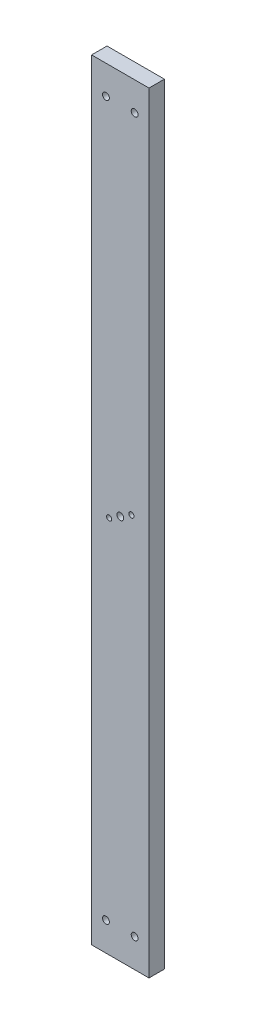
ISO-10303-21;
HEADER;
FILE_DESCRIPTION(('STEP AP214'),'2;1');
FILE_NAME('part.step','',(''),(''),'','','');
FILE_SCHEMA(('AUTOMOTIVE_DESIGN { 1 0 10303 214 1 1 1 1 }'));
ENDSEC;
DATA;
#1=APPLICATION_CONTEXT('core data for automotive mechanical design processes');
#2=APPLICATION_PROTOCOL_DEFINITION('international standard','automotive_design',2000,#1);
#3=PRODUCT_CONTEXT('',#1,'mechanical');
#4=PRODUCT('Part','Part','',(#3));
#5=PRODUCT_RELATED_PRODUCT_CATEGORY('part','',(#4));
#6=PRODUCT_DEFINITION_FORMATION('','',#4);
#7=PRODUCT_DEFINITION_CONTEXT('part definition',#1,'design');
#8=PRODUCT_DEFINITION('design','',#6,#7);
#9=PRODUCT_DEFINITION_SHAPE('','',#8);
#10=(LENGTH_UNIT() NAMED_UNIT(*) SI_UNIT(.MILLI.,.METRE.));
#11=(NAMED_UNIT(*) PLANE_ANGLE_UNIT() SI_UNIT($,.RADIAN.));
#12=(NAMED_UNIT(*) SI_UNIT($,.STERADIAN.) SOLID_ANGLE_UNIT());
#13=UNCERTAINTY_MEASURE_WITH_UNIT(LENGTH_MEASURE(1.E-05),#10,'distance_accuracy_value','');
#14=(GEOMETRIC_REPRESENTATION_CONTEXT(3) GLOBAL_UNCERTAINTY_ASSIGNED_CONTEXT((#13)) GLOBAL_UNIT_ASSIGNED_CONTEXT((#10,
#11,#12)) REPRESENTATION_CONTEXT('',''));
#15=CARTESIAN_POINT('',(0.,0.,0.));
#16=DIRECTION('',(0.,0.,1.));
#17=DIRECTION('',(1.,0.,0.));
#18=AXIS2_PLACEMENT_3D('',#15,#16,#17);
#19=CARTESIAN_POINT('',(0.,0.,18.));
#20=DIRECTION('',(0.,0.,1.));
#21=DIRECTION('',(1.,0.,0.));
#22=AXIS2_PLACEMENT_3D('',#19,#20,#21);
#23=PLANE('',#22);
#24=CARTESIAN_POINT('',(342.08843381725,405.447368421053,18.));
#25=DIRECTION('',(0.,0.,1.));
#26=DIRECTION('',(-1.,0.,0.));
#27=AXIS2_PLACEMENT_3D('',#24,#25,#26);
#28=CIRCLE('',#27,3.99999999999999);
#29=CARTESIAN_POINT('',(338.08843381725,405.447368421053,18.));
#30=VERTEX_POINT('',#29);
#31=EDGE_CURVE('E139',#30,#30,#28,.T.);
#32=ORIENTED_EDGE('',*,*,#31,.F.);
#33=EDGE_LOOP('',(#32));
#34=FACE_BOUND('',#33,.T.);
#35=CARTESIAN_POINT('',(308.58843381725,-427.552631578947,18.));
#36=DIRECTION('',(0.,0.,1.));
#37=DIRECTION('',(1.,0.,0.));
#38=AXIS2_PLACEMENT_3D('',#35,#36,#37);
#39=CIRCLE('',#38,3.99999999999999);
#40=CARTESIAN_POINT('',(312.58843381725,-427.552631578947,18.));
#41=VERTEX_POINT('',#40);
#42=EDGE_CURVE('E127',#41,#41,#39,.T.);
#43=ORIENTED_EDGE('',*,*,#42,.F.);
#44=EDGE_LOOP('',(#43));
#45=FACE_BOUND('',#44,.T.);
#46=CARTESIAN_POINT('',(312.33843381725,-19.0526315789474,18.));
#47=DIRECTION('',(0.,0.,1.));
#48=DIRECTION('',(1.,0.,0.));
#49=AXIS2_PLACEMENT_3D('',#46,#47,#48);
#50=CIRCLE('',#49,2.99999999999999);
#51=CARTESIAN_POINT('',(315.33843381725,-19.0526315789474,18.));
#52=VERTEX_POINT('',#51);
#53=EDGE_CURVE('E115',#52,#52,#50,.T.);
#54=ORIENTED_EDGE('',*,*,#53,.F.);
#55=EDGE_LOOP('',(#54));
#56=FACE_BOUND('',#55,.T.);
#57=DIRECTION('',(0.,-1.,0.));
#58=VECTOR('',#57,1.);
#59=CARTESIAN_POINT('',(291.83843381725,438.947368421053,18.));
#60=LINE('',#59,#58);
#61=CARTESIAN_POINT('',(291.83843381725,438.947368421053,18.));
#62=VERTEX_POINT('',#61);
#63=CARTESIAN_POINT('',(291.83843381725,-461.052631578947,18.));
#64=VERTEX_POINT('',#63);
#65=EDGE_CURVE('E85',#62,#64,#60,.T.);
#66=ORIENTED_EDGE('',*,*,#65,.T.);
#67=DIRECTION('',(1.,0.,0.));
#68=VECTOR('',#67,1.);
#69=CARTESIAN_POINT('',(291.83843381725,-461.052631578947,18.));
#70=LINE('',#69,#68);
#71=CARTESIAN_POINT('',(358.83843381725,-461.052631578947,18.));
#72=VERTEX_POINT('',#71);
#73=EDGE_CURVE('E80',#64,#72,#70,.T.);
#74=ORIENTED_EDGE('',*,*,#73,.T.);
#75=DIRECTION('',(0.,1.,0.));
#76=VECTOR('',#75,1.);
#77=CARTESIAN_POINT('',(358.83843381725,438.947368421053,18.));
#78=LINE('',#77,#76);
#79=CARTESIAN_POINT('',(358.83843381725,438.947368421053,18.));
#80=VERTEX_POINT('',#79);
#81=EDGE_CURVE('E83',#72,#80,#78,.T.);
#82=ORIENTED_EDGE('',*,*,#81,.T.);
#83=DIRECTION('',(-1.,0.,0.));
#84=VECTOR('',#83,1.);
#85=CARTESIAN_POINT('',(291.83843381725,438.947368421053,18.));
#86=LINE('',#85,#84);
#87=EDGE_CURVE('E50',#80,#62,#86,.T.);
#88=ORIENTED_EDGE('',*,*,#87,.T.);
#89=EDGE_LOOP('',(#66,#74,#82,#88));
#90=FACE_BOUND('',#89,.T.);
#91=CARTESIAN_POINT('',(325.33843381725,-11.0526315789474,18.));
#92=DIRECTION('',(0.,0.,1.));
#93=DIRECTION('',(1.,0.,0.));
#94=AXIS2_PLACEMENT_3D('',#91,#92,#93);
#95=CIRCLE('',#94,3.99999999999999);
#96=CARTESIAN_POINT('',(329.33843381725,-11.0526315789474,18.));
#97=VERTEX_POINT('',#96);
#98=EDGE_CURVE('E100',#97,#97,#95,.T.);
#99=ORIENTED_EDGE('',*,*,#98,.F.);
#100=EDGE_LOOP('',(#99));
#101=FACE_BOUND('',#100,.T.);
#102=CARTESIAN_POINT('',(338.33843381725,-3.05263157894737,18.));
#103=DIRECTION('',(0.,0.,1.));
#104=DIRECTION('',(1.,0.,0.));
#105=AXIS2_PLACEMENT_3D('',#102,#103,#104);
#106=CIRCLE('',#105,2.99999999999999);
#107=CARTESIAN_POINT('',(341.33843381725,-3.05263157894737,18.));
#108=VERTEX_POINT('',#107);
#109=EDGE_CURVE('E121',#108,#108,#106,.T.);
#110=ORIENTED_EDGE('',*,*,#109,.F.);
#111=EDGE_LOOP('',(#110));
#112=FACE_BOUND('',#111,.T.);
#113=CARTESIAN_POINT('',(342.08843381725,-427.552631578947,18.));
#114=DIRECTION('',(0.,0.,1.));
#115=DIRECTION('',(1.,0.,0.));
#116=AXIS2_PLACEMENT_3D('',#113,#114,#115);
#117=CIRCLE('',#116,3.99999999999999);
#118=CARTESIAN_POINT('',(346.08843381725,-427.552631578947,18.));
#119=VERTEX_POINT('',#118);
#120=EDGE_CURVE('E133',#119,#119,#117,.T.);
#121=ORIENTED_EDGE('',*,*,#120,.F.);
#122=EDGE_LOOP('',(#121));
#123=FACE_BOUND('',#122,.T.);
#124=CARTESIAN_POINT('',(308.58843381725,405.447368421053,18.));
#125=DIRECTION('',(0.,0.,1.));
#126=DIRECTION('',(-1.,0.,0.));
#127=AXIS2_PLACEMENT_3D('',#124,#125,#126);
#128=CIRCLE('',#127,3.99999999999999);
#129=CARTESIAN_POINT('',(304.58843381725,405.447368421053,18.));
#130=VERTEX_POINT('',#129);
#131=EDGE_CURVE('E145',#130,#130,#128,.T.);
#132=ORIENTED_EDGE('',*,*,#131,.F.);
#133=EDGE_LOOP('',(#132));
#134=FACE_BOUND('',#133,.T.);
#135=ADVANCED_FACE('F33',(#34,#45,#56,#90,#101,#112,#123,#134),#23,.T.);
#136=CARTESIAN_POINT('',(0.,0.,0.));
#137=DIRECTION('',(0.,0.,1.));
#138=DIRECTION('',(1.,0.,0.));
#139=AXIS2_PLACEMENT_3D('',#136,#137,#138);
#140=PLANE('',#139);
#141=DIRECTION('',(0.,-1.,0.));
#142=VECTOR('',#141,1.);
#143=CARTESIAN_POINT('',(291.83843381725,438.947368421053,0.));
#144=LINE('',#143,#142);
#145=CARTESIAN_POINT('',(291.83843381725,438.947368421053,0.));
#146=VERTEX_POINT('',#145);
#147=CARTESIAN_POINT('',(291.83843381725,-461.052631578947,0.));
#148=VERTEX_POINT('',#147);
#149=EDGE_CURVE('E97',#146,#148,#144,.T.);
#150=ORIENTED_EDGE('',*,*,#149,.F.);
#151=DIRECTION('',(-1.,0.,0.));
#152=VECTOR('',#151,1.);
#153=CARTESIAN_POINT('',(291.83843381725,438.947368421053,0.));
#154=LINE('',#153,#152);
#155=CARTESIAN_POINT('',(358.83843381725,438.947368421053,0.));
#156=VERTEX_POINT('',#155);
#157=EDGE_CURVE('E73',#156,#146,#154,.T.);
#158=ORIENTED_EDGE('',*,*,#157,.F.);
#159=DIRECTION('',(0.,1.,0.));
#160=VECTOR('',#159,1.);
#161=CARTESIAN_POINT('',(358.83843381725,438.947368421053,0.));
#162=LINE('',#161,#160);
#163=CARTESIAN_POINT('',(358.83843381725,-461.052631578947,0.));
#164=VERTEX_POINT('',#163);
#165=EDGE_CURVE('E67',#164,#156,#162,.T.);
#166=ORIENTED_EDGE('',*,*,#165,.F.);
#167=DIRECTION('',(1.,0.,0.));
#168=VECTOR('',#167,1.);
#169=CARTESIAN_POINT('',(291.83843381725,-461.052631578947,0.));
#170=LINE('',#169,#168);
#171=EDGE_CURVE('E89',#148,#164,#170,.T.);
#172=ORIENTED_EDGE('',*,*,#171,.F.);
#173=EDGE_LOOP('',(#150,#158,#166,#172));
#174=FACE_BOUND('',#173,.T.);
#175=CARTESIAN_POINT('',(325.33843381725,-11.0526315789474,0.));
#176=DIRECTION('',(0.,0.,1.));
#177=DIRECTION('',(1.,0.,0.));
#178=AXIS2_PLACEMENT_3D('',#175,#176,#177);
#179=CIRCLE('',#178,3.99999999999999);
#180=CARTESIAN_POINT('',(329.33843381725,-11.0526315789474,0.));
#181=VERTEX_POINT('',#180);
#182=EDGE_CURVE('E112',#181,#181,#179,.T.);
#183=ORIENTED_EDGE('',*,*,#182,.T.);
#184=EDGE_LOOP('',(#183));
#185=FACE_BOUND('',#184,.T.);
#186=CARTESIAN_POINT('',(312.33843381725,-19.0526315789474,0.));
#187=DIRECTION('',(0.,0.,1.));
#188=DIRECTION('',(1.,0.,0.));
#189=AXIS2_PLACEMENT_3D('',#186,#187,#188);
#190=CIRCLE('',#189,2.99999999999999);
#191=CARTESIAN_POINT('',(315.33843381725,-19.0526315789474,0.));
#192=VERTEX_POINT('',#191);
#193=EDGE_CURVE('E118',#192,#192,#190,.T.);
#194=ORIENTED_EDGE('',*,*,#193,.T.);
#195=EDGE_LOOP('',(#194));
#196=FACE_BOUND('',#195,.T.);
#197=CARTESIAN_POINT('',(338.33843381725,-3.05263157894737,0.));
#198=DIRECTION('',(0.,0.,1.));
#199=DIRECTION('',(1.,0.,0.));
#200=AXIS2_PLACEMENT_3D('',#197,#198,#199);
#201=CIRCLE('',#200,2.99999999999999);
#202=CARTESIAN_POINT('',(341.33843381725,-3.05263157894737,0.));
#203=VERTEX_POINT('',#202);
#204=EDGE_CURVE('E124',#203,#203,#201,.T.);
#205=ORIENTED_EDGE('',*,*,#204,.T.);
#206=EDGE_LOOP('',(#205));
#207=FACE_BOUND('',#206,.T.);
#208=CARTESIAN_POINT('',(308.58843381725,-427.552631578947,0.));
#209=DIRECTION('',(0.,0.,1.));
#210=DIRECTION('',(1.,0.,0.));
#211=AXIS2_PLACEMENT_3D('',#208,#209,#210);
#212=CIRCLE('',#211,3.99999999999999);
#213=CARTESIAN_POINT('',(312.58843381725,-427.552631578947,0.));
#214=VERTEX_POINT('',#213);
#215=EDGE_CURVE('E130',#214,#214,#212,.T.);
#216=ORIENTED_EDGE('',*,*,#215,.T.);
#217=EDGE_LOOP('',(#216));
#218=FACE_BOUND('',#217,.T.);
#219=CARTESIAN_POINT('',(342.08843381725,-427.552631578947,0.));
#220=DIRECTION('',(0.,0.,1.));
#221=DIRECTION('',(1.,0.,0.));
#222=AXIS2_PLACEMENT_3D('',#219,#220,#221);
#223=CIRCLE('',#222,3.99999999999999);
#224=CARTESIAN_POINT('',(346.08843381725,-427.552631578947,0.));
#225=VERTEX_POINT('',#224);
#226=EDGE_CURVE('E136',#225,#225,#223,.T.);
#227=ORIENTED_EDGE('',*,*,#226,.T.);
#228=EDGE_LOOP('',(#227));
#229=FACE_BOUND('',#228,.T.);
#230=CARTESIAN_POINT('',(342.08843381725,405.447368421053,0.));
#231=DIRECTION('',(0.,0.,1.));
#232=DIRECTION('',(-1.,0.,0.));
#233=AXIS2_PLACEMENT_3D('',#230,#231,#232);
#234=CIRCLE('',#233,3.99999999999999);
#235=CARTESIAN_POINT('',(338.08843381725,405.447368421053,0.));
#236=VERTEX_POINT('',#235);
#237=EDGE_CURVE('E142',#236,#236,#234,.T.);
#238=ORIENTED_EDGE('',*,*,#237,.T.);
#239=EDGE_LOOP('',(#238));
#240=FACE_BOUND('',#239,.T.);
#241=CARTESIAN_POINT('',(308.58843381725,405.447368421053,0.));
#242=DIRECTION('',(0.,0.,1.));
#243=DIRECTION('',(-1.,0.,0.));
#244=AXIS2_PLACEMENT_3D('',#241,#242,#243);
#245=CIRCLE('',#244,3.99999999999999);
#246=CARTESIAN_POINT('',(304.58843381725,405.447368421053,0.));
#247=VERTEX_POINT('',#246);
#248=EDGE_CURVE('E148',#247,#247,#245,.T.);
#249=ORIENTED_EDGE('',*,*,#248,.T.);
#250=EDGE_LOOP('',(#249));
#251=FACE_BOUND('',#250,.T.);
#252=ADVANCED_FACE('F108',(#174,#185,#196,#207,#218,#229,#240,#251),#140,.F.);
#253=CARTESIAN_POINT('',(291.83843381725,438.947368421053,18.));
#254=DIRECTION('',(1.,0.,0.));
#255=DIRECTION('',(0.,1.,0.));
#256=AXIS2_PLACEMENT_3D('',#253,#254,#255);
#257=PLANE('',#256);
#258=ORIENTED_EDGE('',*,*,#149,.T.);
#259=DIRECTION('',(0.,0.,-1.));
#260=VECTOR('',#259,1.);
#261=CARTESIAN_POINT('',(291.83843381725,-461.052631578947,18.));
#262=LINE('',#261,#260);
#263=EDGE_CURVE('E11',#64,#148,#262,.T.);
#264=ORIENTED_EDGE('',*,*,#263,.F.);
#265=ORIENTED_EDGE('',*,*,#65,.F.);
#266=DIRECTION('',(0.,0.,-1.));
#267=VECTOR('',#266,1.);
#268=CARTESIAN_POINT('',(291.83843381725,438.947368421053,18.));
#269=LINE('',#268,#267);
#270=EDGE_CURVE('E93',#62,#146,#269,.T.);
#271=ORIENTED_EDGE('',*,*,#270,.T.);
#272=EDGE_LOOP('',(#258,#264,#265,#271));
#273=FACE_BOUND('',#272,.T.);
#274=ADVANCED_FACE('F35',(#273),#257,.F.);
#275=CARTESIAN_POINT('',(291.83843381725,-461.052631578947,18.));
#276=DIRECTION('',(0.,1.,0.));
#277=DIRECTION('',(0.,0.,1.));
#278=AXIS2_PLACEMENT_3D('',#275,#276,#277);
#279=PLANE('',#278);
#280=ORIENTED_EDGE('',*,*,#171,.T.);
#281=DIRECTION('',(0.,0.,-1.));
#282=VECTOR('',#281,1.);
#283=CARTESIAN_POINT('',(358.83843381725,-461.052631578947,18.));
#284=LINE('',#283,#282);
#285=EDGE_CURVE('E42',#72,#164,#284,.T.);
#286=ORIENTED_EDGE('',*,*,#285,.F.);
#287=ORIENTED_EDGE('',*,*,#73,.F.);
#288=ORIENTED_EDGE('',*,*,#263,.T.);
#289=EDGE_LOOP('',(#280,#286,#287,#288));
#290=FACE_BOUND('',#289,.T.);
#291=ADVANCED_FACE('F88',(#290),#279,.F.);
#292=CARTESIAN_POINT('',(358.83843381725,438.947368421053,18.));
#293=DIRECTION('',(-1.,0.,0.));
#294=DIRECTION('',(0.,-1.,0.));
#295=AXIS2_PLACEMENT_3D('',#292,#293,#294);
#296=PLANE('',#295);
#297=ORIENTED_EDGE('',*,*,#165,.T.);
#298=DIRECTION('',(0.,0.,-1.));
#299=VECTOR('',#298,1.);
#300=CARTESIAN_POINT('',(358.83843381725,438.947368421053,18.));
#301=LINE('',#300,#299);
#302=EDGE_CURVE('E90',#80,#156,#301,.T.);
#303=ORIENTED_EDGE('',*,*,#302,.F.);
#304=ORIENTED_EDGE('',*,*,#81,.F.);
#305=ORIENTED_EDGE('',*,*,#285,.T.);
#306=EDGE_LOOP('',(#297,#303,#304,#305));
#307=FACE_BOUND('',#306,.T.);
#308=ADVANCED_FACE('F91',(#307),#296,.F.);
#309=CARTESIAN_POINT('',(291.83843381725,438.947368421053,18.));
#310=DIRECTION('',(0.,-1.,0.));
#311=DIRECTION('',(1.,0.,0.));
#312=AXIS2_PLACEMENT_3D('',#309,#310,#311);
#313=PLANE('',#312);
#314=ORIENTED_EDGE('',*,*,#157,.T.);
#315=ORIENTED_EDGE('',*,*,#270,.F.);
#316=ORIENTED_EDGE('',*,*,#87,.F.);
#317=ORIENTED_EDGE('',*,*,#302,.T.);
#318=EDGE_LOOP('',(#314,#315,#316,#317));
#319=FACE_BOUND('',#318,.T.);
#320=ADVANCED_FACE('F105',(#319),#313,.F.);
#321=CARTESIAN_POINT('',(325.33843381725,-11.0526315789474,18.));
#322=DIRECTION('',(0.,0.,-1.));
#323=DIRECTION('',(-1.,0.,0.));
#324=AXIS2_PLACEMENT_3D('',#321,#322,#323);
#325=CYLINDRICAL_SURFACE('',#324,3.99999999999999);
#326=ORIENTED_EDGE('',*,*,#98,.T.);
#327=EDGE_LOOP('',(#326));
#328=FACE_BOUND('',#327,.T.);
#329=ORIENTED_EDGE('',*,*,#182,.F.);
#330=EDGE_LOOP('',(#329));
#331=FACE_BOUND('',#330,.T.);
#332=ADVANCED_FACE('F167',(#328,#331),#325,.F.);
#333=CARTESIAN_POINT('',(312.33843381725,-19.0526315789474,18.));
#334=DIRECTION('',(0.,0.,-1.));
#335=DIRECTION('',(-1.,0.,0.));
#336=AXIS2_PLACEMENT_3D('',#333,#334,#335);
#337=CYLINDRICAL_SURFACE('',#336,2.99999999999999);
#338=ORIENTED_EDGE('',*,*,#53,.T.);
#339=EDGE_LOOP('',(#338));
#340=FACE_BOUND('',#339,.T.);
#341=ORIENTED_EDGE('',*,*,#193,.F.);
#342=EDGE_LOOP('',(#341));
#343=FACE_BOUND('',#342,.T.);
#344=ADVANCED_FACE('F213',(#340,#343),#337,.F.);
#345=CARTESIAN_POINT('',(338.33843381725,-3.05263157894737,18.));
#346=DIRECTION('',(0.,0.,-1.));
#347=DIRECTION('',(-1.,0.,0.));
#348=AXIS2_PLACEMENT_3D('',#345,#346,#347);
#349=CYLINDRICAL_SURFACE('',#348,2.99999999999999);
#350=ORIENTED_EDGE('',*,*,#109,.T.);
#351=EDGE_LOOP('',(#350));
#352=FACE_BOUND('',#351,.T.);
#353=ORIENTED_EDGE('',*,*,#204,.F.);
#354=EDGE_LOOP('',(#353));
#355=FACE_BOUND('',#354,.T.);
#356=ADVANCED_FACE('F221',(#352,#355),#349,.F.);
#357=CARTESIAN_POINT('',(308.58843381725,-427.552631578947,18.));
#358=DIRECTION('',(0.,0.,-1.));
#359=DIRECTION('',(-1.,0.,0.));
#360=AXIS2_PLACEMENT_3D('',#357,#358,#359);
#361=CYLINDRICAL_SURFACE('',#360,3.99999999999999);
#362=ORIENTED_EDGE('',*,*,#42,.T.);
#363=EDGE_LOOP('',(#362));
#364=FACE_BOUND('',#363,.T.);
#365=ORIENTED_EDGE('',*,*,#215,.F.);
#366=EDGE_LOOP('',(#365));
#367=FACE_BOUND('',#366,.T.);
#368=ADVANCED_FACE('F229',(#364,#367),#361,.F.);
#369=CARTESIAN_POINT('',(342.08843381725,-427.552631578947,18.));
#370=DIRECTION('',(0.,0.,-1.));
#371=DIRECTION('',(-1.,0.,0.));
#372=AXIS2_PLACEMENT_3D('',#369,#370,#371);
#373=CYLINDRICAL_SURFACE('',#372,3.99999999999999);
#374=ORIENTED_EDGE('',*,*,#120,.T.);
#375=EDGE_LOOP('',(#374));
#376=FACE_BOUND('',#375,.T.);
#377=ORIENTED_EDGE('',*,*,#226,.F.);
#378=EDGE_LOOP('',(#377));
#379=FACE_BOUND('',#378,.T.);
#380=ADVANCED_FACE('F238',(#376,#379),#373,.F.);
#381=CARTESIAN_POINT('',(342.08843381725,405.447368421053,18.));
#382=DIRECTION('',(0.,0.,-1.));
#383=DIRECTION('',(-1.,0.,0.));
#384=AXIS2_PLACEMENT_3D('',#381,#382,#383);
#385=CYLINDRICAL_SURFACE('',#384,3.99999999999999);
#386=ORIENTED_EDGE('',*,*,#31,.T.);
#387=EDGE_LOOP('',(#386));
#388=FACE_BOUND('',#387,.T.);
#389=ORIENTED_EDGE('',*,*,#237,.F.);
#390=EDGE_LOOP('',(#389));
#391=FACE_BOUND('',#390,.T.);
#392=ADVANCED_FACE('F247',(#388,#391),#385,.F.);
#393=CARTESIAN_POINT('',(308.58843381725,405.447368421053,18.));
#394=DIRECTION('',(0.,0.,-1.));
#395=DIRECTION('',(-1.,0.,0.));
#396=AXIS2_PLACEMENT_3D('',#393,#394,#395);
#397=CYLINDRICAL_SURFACE('',#396,3.99999999999999);
#398=ORIENTED_EDGE('',*,*,#131,.T.);
#399=EDGE_LOOP('',(#398));
#400=FACE_BOUND('',#399,.T.);
#401=ORIENTED_EDGE('',*,*,#248,.F.);
#402=EDGE_LOOP('',(#401));
#403=FACE_BOUND('',#402,.T.);
#404=ADVANCED_FACE('F154',(#400,#403),#397,.F.);
#405=CLOSED_SHELL('',(#135,#252,#274,#291,#308,#320,#332,#344,#356,#368,#380,#392,#404));
#406=MANIFOLD_SOLID_BREP('B2',#405);
#407=ADVANCED_BREP_SHAPE_REPRESENTATION('',(#18,#406),#14);
#408=SHAPE_DEFINITION_REPRESENTATION(#9,#407);
ENDSEC;
END-ISO-10303-21;
